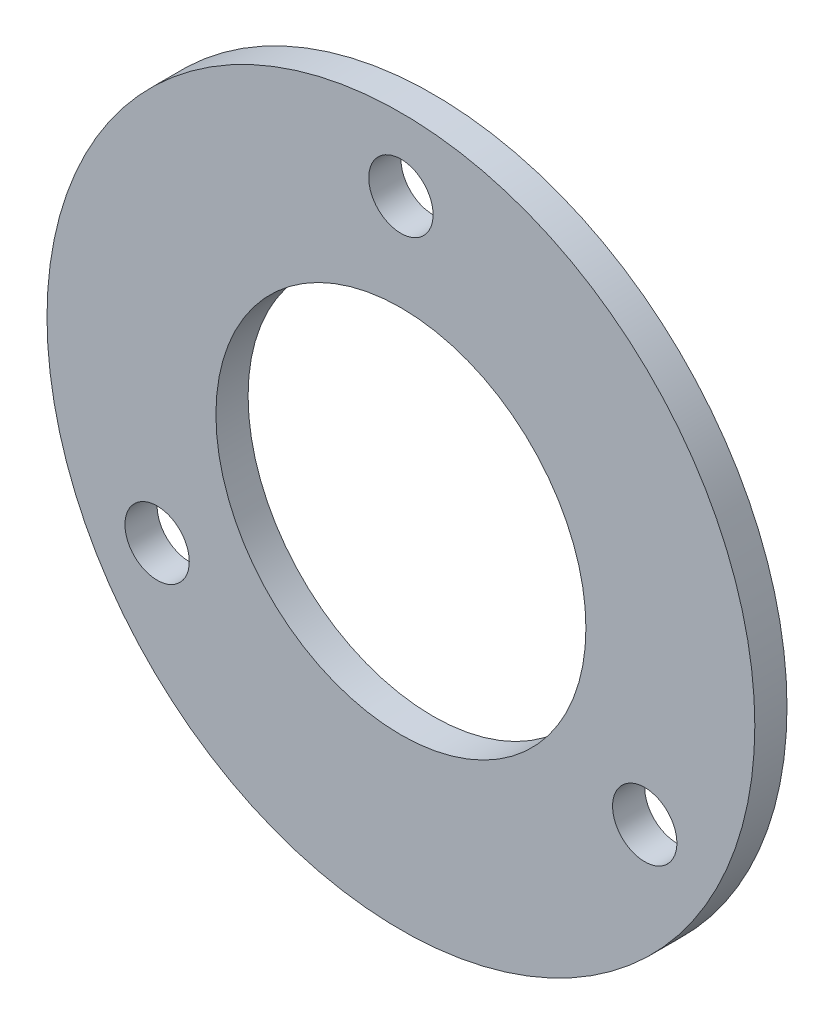
ISO-10303-21;
HEADER;
FILE_DESCRIPTION(('STEP AP214'),'2;1');
FILE_NAME('part.step','',(''),(''),'','','');
FILE_SCHEMA(('AUTOMOTIVE_DESIGN { 1 0 10303 214 1 1 1 1 }'));
ENDSEC;
DATA;
#1=APPLICATION_CONTEXT('core data for automotive mechanical design processes');
#2=APPLICATION_PROTOCOL_DEFINITION('international standard','automotive_design',2000,#1);
#3=PRODUCT_CONTEXT('',#1,'mechanical');
#4=PRODUCT('Part','Part','',(#3));
#5=PRODUCT_RELATED_PRODUCT_CATEGORY('part','',(#4));
#6=PRODUCT_DEFINITION_FORMATION('','',#4);
#7=PRODUCT_DEFINITION_CONTEXT('part definition',#1,'design');
#8=PRODUCT_DEFINITION('design','',#6,#7);
#9=PRODUCT_DEFINITION_SHAPE('','',#8);
#10=(LENGTH_UNIT() NAMED_UNIT(*) SI_UNIT(.MILLI.,.METRE.));
#11=(NAMED_UNIT(*) PLANE_ANGLE_UNIT() SI_UNIT($,.RADIAN.));
#12=(NAMED_UNIT(*) SI_UNIT($,.STERADIAN.) SOLID_ANGLE_UNIT());
#13=UNCERTAINTY_MEASURE_WITH_UNIT(LENGTH_MEASURE(1.E-05),#10,'distance_accuracy_value','');
#14=(GEOMETRIC_REPRESENTATION_CONTEXT(3) GLOBAL_UNCERTAINTY_ASSIGNED_CONTEXT((#13)) GLOBAL_UNIT_ASSIGNED_CONTEXT((#10,
#11,#12)) REPRESENTATION_CONTEXT('',''));
#15=CARTESIAN_POINT('',(0.,0.,0.));
#16=DIRECTION('',(0.,0.,1.));
#17=DIRECTION('',(1.,0.,0.));
#18=AXIS2_PLACEMENT_3D('',#15,#16,#17);
#19=CARTESIAN_POINT('',(0.,0.,2.));
#20=DIRECTION('',(0.,0.,1.));
#21=DIRECTION('',(1.,0.,0.));
#22=AXIS2_PLACEMENT_3D('',#19,#20,#21);
#23=PLANE('',#22);
#24=CARTESIAN_POINT('',(15.1554445662276,-8.75000000000007,2.));
#25=DIRECTION('',(0.,0.,1.));
#26=DIRECTION('',(1.,0.,0.));
#27=AXIS2_PLACEMENT_3D('',#24,#25,#26);
#28=CIRCLE('',#27,2.);
#29=CARTESIAN_POINT('',(17.1554445662276,-8.75000000000007,2.));
#30=VERTEX_POINT('',#29);
#31=EDGE_CURVE('E60',#30,#30,#28,.T.);
#32=ORIENTED_EDGE('',*,*,#31,.F.);
#33=EDGE_LOOP('',(#32));
#34=FACE_BOUND('',#33,.T.);
#35=CARTESIAN_POINT('',(0.,17.5,2.));
#36=DIRECTION('',(0.,0.,1.));
#37=DIRECTION('',(1.,0.,0.));
#38=AXIS2_PLACEMENT_3D('',#35,#36,#37);
#39=CIRCLE('',#38,2.);
#40=CARTESIAN_POINT('',(2.,17.5,2.));
#41=VERTEX_POINT('',#40);
#42=EDGE_CURVE('E49',#41,#41,#39,.T.);
#43=ORIENTED_EDGE('',*,*,#42,.F.);
#44=EDGE_LOOP('',(#43));
#45=FACE_BOUND('',#44,.T.);
#46=CARTESIAN_POINT('',(0.,0.,2.));
#47=DIRECTION('',(0.,0.,1.));
#48=DIRECTION('',(1.,0.,0.));
#49=AXIS2_PLACEMENT_3D('',#46,#47,#48);
#50=CIRCLE('',#49,22.);
#51=CARTESIAN_POINT('',(22.,0.,2.));
#52=VERTEX_POINT('',#51);
#53=EDGE_CURVE('E10',#52,#52,#50,.T.);
#54=ORIENTED_EDGE('',*,*,#53,.T.);
#55=EDGE_LOOP('',(#54));
#56=FACE_BOUND('',#55,.T.);
#57=CARTESIAN_POINT('',(0.,0.,2.));
#58=DIRECTION('',(0.,0.,1.));
#59=DIRECTION('',(1.,0.,0.));
#60=AXIS2_PLACEMENT_3D('',#57,#58,#59);
#61=CIRCLE('',#60,11.5);
#62=CARTESIAN_POINT('',(11.5,0.,2.));
#63=VERTEX_POINT('',#62);
#64=EDGE_CURVE('E54',#63,#63,#61,.T.);
#65=ORIENTED_EDGE('',*,*,#64,.F.);
#66=EDGE_LOOP('',(#65));
#67=FACE_BOUND('',#66,.T.);
#68=CARTESIAN_POINT('',(-15.1554445662278,-8.74999999999986,2.));
#69=DIRECTION('',(0.,0.,1.));
#70=DIRECTION('',(1.,0.,0.));
#71=AXIS2_PLACEMENT_3D('',#68,#69,#70);
#72=CIRCLE('',#71,2.);
#73=CARTESIAN_POINT('',(-13.1554445662278,-8.74999999999986,2.));
#74=VERTEX_POINT('',#73);
#75=EDGE_CURVE('E66',#74,#74,#72,.T.);
#76=ORIENTED_EDGE('',*,*,#75,.F.);
#77=EDGE_LOOP('',(#76));
#78=FACE_BOUND('',#77,.T.);
#79=ADVANCED_FACE('F38',(#34,#45,#56,#67,#78),#23,.T.);
#80=CARTESIAN_POINT('',(0.,0.,0.));
#81=DIRECTION('',(0.,0.,1.));
#82=DIRECTION('',(1.,0.,0.));
#83=AXIS2_PLACEMENT_3D('',#80,#81,#82);
#84=PLANE('',#83);
#85=CARTESIAN_POINT('',(0.,0.,0.));
#86=DIRECTION('',(0.,0.,1.));
#87=DIRECTION('',(1.,0.,0.));
#88=AXIS2_PLACEMENT_3D('',#85,#86,#87);
#89=CIRCLE('',#88,22.);
#90=CARTESIAN_POINT('',(22.,0.,0.));
#91=VERTEX_POINT('',#90);
#92=EDGE_CURVE('E42',#91,#91,#89,.T.);
#93=ORIENTED_EDGE('',*,*,#92,.F.);
#94=EDGE_LOOP('',(#93));
#95=FACE_BOUND('',#94,.T.);
#96=CARTESIAN_POINT('',(0.,17.5,0.));
#97=DIRECTION('',(0.,0.,1.));
#98=DIRECTION('',(1.,0.,0.));
#99=AXIS2_PLACEMENT_3D('',#96,#97,#98);
#100=CIRCLE('',#99,2.);
#101=CARTESIAN_POINT('',(2.,17.5,0.));
#102=VERTEX_POINT('',#101);
#103=EDGE_CURVE('E51',#102,#102,#100,.T.);
#104=ORIENTED_EDGE('',*,*,#103,.T.);
#105=EDGE_LOOP('',(#104));
#106=FACE_BOUND('',#105,.T.);
#107=CARTESIAN_POINT('',(0.,0.,0.));
#108=DIRECTION('',(0.,0.,1.));
#109=DIRECTION('',(1.,0.,0.));
#110=AXIS2_PLACEMENT_3D('',#107,#108,#109);
#111=CIRCLE('',#110,11.5);
#112=CARTESIAN_POINT('',(11.5,0.,0.));
#113=VERTEX_POINT('',#112);
#114=EDGE_CURVE('E57',#113,#113,#111,.T.);
#115=ORIENTED_EDGE('',*,*,#114,.T.);
#116=EDGE_LOOP('',(#115));
#117=FACE_BOUND('',#116,.T.);
#118=CARTESIAN_POINT('',(15.1554445662276,-8.75000000000007,0.));
#119=DIRECTION('',(0.,0.,1.));
#120=DIRECTION('',(1.,0.,0.));
#121=AXIS2_PLACEMENT_3D('',#118,#119,#120);
#122=CIRCLE('',#121,2.);
#123=CARTESIAN_POINT('',(17.1554445662276,-8.75000000000007,0.));
#124=VERTEX_POINT('',#123);
#125=EDGE_CURVE('E63',#124,#124,#122,.T.);
#126=ORIENTED_EDGE('',*,*,#125,.T.);
#127=EDGE_LOOP('',(#126));
#128=FACE_BOUND('',#127,.T.);
#129=CARTESIAN_POINT('',(-15.1554445662278,-8.74999999999986,0.));
#130=DIRECTION('',(0.,0.,1.));
#131=DIRECTION('',(1.,0.,0.));
#132=AXIS2_PLACEMENT_3D('',#129,#130,#131);
#133=CIRCLE('',#132,2.);
#134=CARTESIAN_POINT('',(-13.1554445662278,-8.74999999999986,0.));
#135=VERTEX_POINT('',#134);
#136=EDGE_CURVE('E69',#135,#135,#133,.T.);
#137=ORIENTED_EDGE('',*,*,#136,.T.);
#138=EDGE_LOOP('',(#137));
#139=FACE_BOUND('',#138,.T.);
#140=ADVANCED_FACE('F79',(#95,#106,#117,#128,#139),#84,.F.);
#141=CARTESIAN_POINT('',(0.,0.,2.));
#142=DIRECTION('',(0.,0.,-1.));
#143=DIRECTION('',(-1.,0.,0.));
#144=AXIS2_PLACEMENT_3D('',#141,#142,#143);
#145=CYLINDRICAL_SURFACE('',#144,22.);
#146=ORIENTED_EDGE('',*,*,#53,.F.);
#147=EDGE_LOOP('',(#146));
#148=FACE_BOUND('',#147,.T.);
#149=ORIENTED_EDGE('',*,*,#92,.T.);
#150=EDGE_LOOP('',(#149));
#151=FACE_BOUND('',#150,.T.);
#152=ADVANCED_FACE('F40',(#148,#151),#145,.T.);
#153=CARTESIAN_POINT('',(0.,17.5,2.));
#154=DIRECTION('',(0.,0.,-1.));
#155=DIRECTION('',(-1.,0.,0.));
#156=AXIS2_PLACEMENT_3D('',#153,#154,#155);
#157=CYLINDRICAL_SURFACE('',#156,2.);
#158=ORIENTED_EDGE('',*,*,#42,.T.);
#159=EDGE_LOOP('',(#158));
#160=FACE_BOUND('',#159,.T.);
#161=ORIENTED_EDGE('',*,*,#103,.F.);
#162=EDGE_LOOP('',(#161));
#163=FACE_BOUND('',#162,.T.);
#164=ADVANCED_FACE('F89',(#160,#163),#157,.F.);
#165=CARTESIAN_POINT('',(0.,0.,2.));
#166=DIRECTION('',(0.,0.,-1.));
#167=DIRECTION('',(-1.,0.,0.));
#168=AXIS2_PLACEMENT_3D('',#165,#166,#167);
#169=CYLINDRICAL_SURFACE('',#168,11.5);
#170=ORIENTED_EDGE('',*,*,#64,.T.);
#171=EDGE_LOOP('',(#170));
#172=FACE_BOUND('',#171,.T.);
#173=ORIENTED_EDGE('',*,*,#114,.F.);
#174=EDGE_LOOP('',(#173));
#175=FACE_BOUND('',#174,.T.);
#176=ADVANCED_FACE('F92',(#172,#175),#169,.F.);
#177=CARTESIAN_POINT('',(15.1554445662276,-8.75000000000007,2.));
#178=DIRECTION('',(0.,0.,-1.));
#179=DIRECTION('',(-1.,0.,0.));
#180=AXIS2_PLACEMENT_3D('',#177,#178,#179);
#181=CYLINDRICAL_SURFACE('',#180,2.);
#182=ORIENTED_EDGE('',*,*,#31,.T.);
#183=EDGE_LOOP('',(#182));
#184=FACE_BOUND('',#183,.T.);
#185=ORIENTED_EDGE('',*,*,#125,.F.);
#186=EDGE_LOOP('',(#185));
#187=FACE_BOUND('',#186,.T.);
#188=ADVANCED_FACE('F96',(#184,#187),#181,.F.);
#189=CARTESIAN_POINT('',(-15.1554445662278,-8.74999999999986,2.));
#190=DIRECTION('',(0.,0.,-1.));
#191=DIRECTION('',(-1.,0.,0.));
#192=AXIS2_PLACEMENT_3D('',#189,#190,#191);
#193=CYLINDRICAL_SURFACE('',#192,2.);
#194=ORIENTED_EDGE('',*,*,#75,.T.);
#195=EDGE_LOOP('',(#194));
#196=FACE_BOUND('',#195,.T.);
#197=ORIENTED_EDGE('',*,*,#136,.F.);
#198=EDGE_LOOP('',(#197));
#199=FACE_BOUND('',#198,.T.);
#200=ADVANCED_FACE('F75',(#196,#199),#193,.F.);
#201=CLOSED_SHELL('',(#79,#140,#152,#164,#176,#188,#200));
#202=MANIFOLD_SOLID_BREP('B2',#201);
#203=ADVANCED_BREP_SHAPE_REPRESENTATION('',(#18,#202),#14);
#204=SHAPE_DEFINITION_REPRESENTATION(#9,#203);
ENDSEC;
END-ISO-10303-21;
